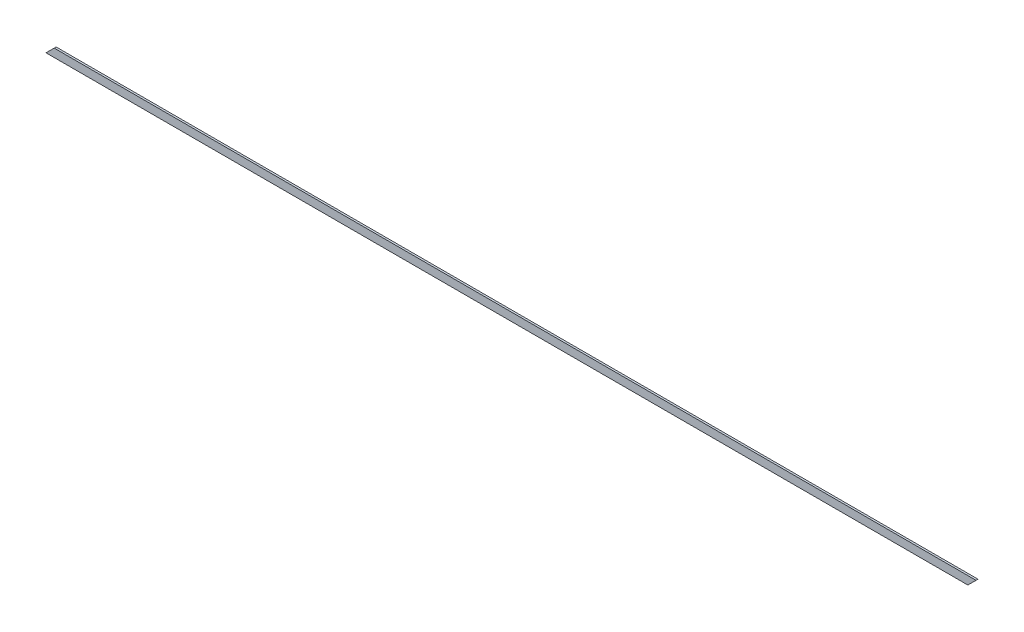
ISO-10303-21;
HEADER;
FILE_DESCRIPTION(('STEP AP214'),'2;1');
FILE_NAME('part.step','',(''),(''),'','','');
FILE_SCHEMA(('AUTOMOTIVE_DESIGN { 1 0 10303 214 1 1 1 1 }'));
ENDSEC;
DATA;
#1=APPLICATION_CONTEXT('core data for automotive mechanical design processes');
#2=APPLICATION_PROTOCOL_DEFINITION('international standard','automotive_design',2000,#1);
#3=PRODUCT_CONTEXT('',#1,'mechanical');
#4=PRODUCT('Part','Part','',(#3));
#5=PRODUCT_RELATED_PRODUCT_CATEGORY('part','',(#4));
#6=PRODUCT_DEFINITION_FORMATION('','',#4);
#7=PRODUCT_DEFINITION_CONTEXT('part definition',#1,'design');
#8=PRODUCT_DEFINITION('design','',#6,#7);
#9=PRODUCT_DEFINITION_SHAPE('','',#8);
#10=(LENGTH_UNIT() NAMED_UNIT(*) SI_UNIT(.MILLI.,.METRE.));
#11=(NAMED_UNIT(*) PLANE_ANGLE_UNIT() SI_UNIT($,.RADIAN.));
#12=(NAMED_UNIT(*) SI_UNIT($,.STERADIAN.) SOLID_ANGLE_UNIT());
#13=UNCERTAINTY_MEASURE_WITH_UNIT(LENGTH_MEASURE(1.E-05),#10,'distance_accuracy_value','');
#14=(GEOMETRIC_REPRESENTATION_CONTEXT(3) GLOBAL_UNCERTAINTY_ASSIGNED_CONTEXT((#13)) GLOBAL_UNIT_ASSIGNED_CONTEXT((#10,
#11,#12)) REPRESENTATION_CONTEXT('',''));
#15=CARTESIAN_POINT('',(0.,0.,0.));
#16=DIRECTION('',(0.,0.,1.));
#17=DIRECTION('',(1.,0.,0.));
#18=AXIS2_PLACEMENT_3D('',#15,#16,#17);
#19=CARTESIAN_POINT('',(266.699999911679,266.699999911679,63.5));
#20=DIRECTION('',(0.707106781186547,-0.707106781186548,0.));
#21=DIRECTION('',(0.707106781186548,0.707106781186547,0.));
#22=AXIS2_PLACEMENT_3D('',#19,#20,#21);
#23=PLANE('',#22);
#24=DIRECTION('',(-0.707106781186548,-0.707106781186547,0.));
#25=VECTOR('',#24,1.);
#26=CARTESIAN_POINT('',(266.699999911679,266.699999911679,0.));
#27=LINE('',#26,#25);
#28=CARTESIAN_POINT('',(266.699999911679,266.699999911679,0.));
#29=VERTEX_POINT('',#28);
#30=CARTESIAN_POINT('',(0.,0.,0.));
#31=VERTEX_POINT('',#30);
#32=EDGE_CURVE('E96',#29,#31,#27,.T.);
#33=ORIENTED_EDGE('',*,*,#32,.T.);
#34=DIRECTION('',(0.,0.,-1.));
#35=VECTOR('',#34,1.);
#36=CARTESIAN_POINT('',(0.,0.,63.5));
#37=LINE('',#36,#35);
#38=CARTESIAN_POINT('',(0.,0.,63.5));
#39=VERTEX_POINT('',#38);
#40=EDGE_CURVE('E11',#39,#31,#37,.T.);
#41=ORIENTED_EDGE('',*,*,#40,.F.);
#42=DIRECTION('',(-0.707106781186548,-0.707106781186547,0.));
#43=VECTOR('',#42,1.);
#44=CARTESIAN_POINT('',(266.699999911679,266.699999911679,63.5));
#45=LINE('',#44,#43);
#46=CARTESIAN_POINT('',(266.699999911679,266.699999911679,63.5));
#47=VERTEX_POINT('',#46);
#48=EDGE_CURVE('E84',#47,#39,#45,.T.);
#49=ORIENTED_EDGE('',*,*,#48,.F.);
#50=DIRECTION('',(0.,0.,-1.));
#51=VECTOR('',#50,1.);
#52=CARTESIAN_POINT('',(266.699999911679,266.699999911679,63.5));
#53=LINE('',#52,#51);
#54=EDGE_CURVE('E92',#47,#29,#53,.T.);
#55=ORIENTED_EDGE('',*,*,#54,.T.);
#56=EDGE_LOOP('',(#33,#41,#49,#55));
#57=FACE_BOUND('',#56,.T.);
#58=ADVANCED_FACE('F33',(#57),#23,.F.);
#59=CARTESIAN_POINT('',(0.,0.,63.5));
#60=DIRECTION('',(0.,1.,0.));
#61=DIRECTION('',(0.,0.,1.));
#62=AXIS2_PLACEMENT_3D('',#59,#60,#61);
#63=PLANE('',#62);
#64=DIRECTION('',(1.,0.,0.));
#65=VECTOR('',#64,1.);
#66=CARTESIAN_POINT('',(0.,0.,0.));
#67=LINE('',#66,#65);
#68=CARTESIAN_POINT('',(30000.,0.,0.));
#69=VERTEX_POINT('',#68);
#70=EDGE_CURVE('E88',#31,#69,#67,.T.);
#71=ORIENTED_EDGE('',*,*,#70,.T.);
#72=DIRECTION('',(0.,0.,-1.));
#73=VECTOR('',#72,1.);
#74=CARTESIAN_POINT('',(30000.,0.,63.5));
#75=LINE('',#74,#73);
#76=CARTESIAN_POINT('',(30000.,0.,63.5));
#77=VERTEX_POINT('',#76);
#78=EDGE_CURVE('E41',#77,#69,#75,.T.);
#79=ORIENTED_EDGE('',*,*,#78,.F.);
#80=DIRECTION('',(1.,0.,0.));
#81=VECTOR('',#80,1.);
#82=CARTESIAN_POINT('',(0.,0.,63.5));
#83=LINE('',#82,#81);
#84=EDGE_CURVE('E79',#39,#77,#83,.T.);
#85=ORIENTED_EDGE('',*,*,#84,.F.);
#86=ORIENTED_EDGE('',*,*,#40,.T.);
#87=EDGE_LOOP('',(#71,#79,#85,#86));
#88=FACE_BOUND('',#87,.T.);
#89=ADVANCED_FACE('F87',(#88),#63,.F.);
#90=CARTESIAN_POINT('',(30000.,0.,63.5));
#91=DIRECTION('',(-0.707106781186551,0.707106781186544,0.));
#92=DIRECTION('',(-0.707106781186544,-0.707106781186551,0.));
#93=AXIS2_PLACEMENT_3D('',#90,#91,#92);
#94=PLANE('',#93);
#95=DIRECTION('',(0.707106781186544,0.707106781186551,0.));
#96=VECTOR('',#95,1.);
#97=CARTESIAN_POINT('',(30000.,0.,0.));
#98=LINE('',#97,#96);
#99=CARTESIAN_POINT('',(30266.6999999117,266.699999911683,0.));
#100=VERTEX_POINT('',#99);
#101=EDGE_CURVE('E66',#69,#100,#98,.T.);
#102=ORIENTED_EDGE('',*,*,#101,.T.);
#103=DIRECTION('',(0.,0.,-1.));
#104=VECTOR('',#103,1.);
#105=CARTESIAN_POINT('',(30266.6999999117,266.699999911683,63.5));
#106=LINE('',#105,#104);
#107=CARTESIAN_POINT('',(30266.6999999117,266.699999911683,63.5));
#108=VERTEX_POINT('',#107);
#109=EDGE_CURVE('E89',#108,#100,#106,.T.);
#110=ORIENTED_EDGE('',*,*,#109,.F.);
#111=DIRECTION('',(0.707106781186544,0.707106781186551,0.));
#112=VECTOR('',#111,1.);
#113=CARTESIAN_POINT('',(30000.,0.,63.5));
#114=LINE('',#113,#112);
#115=EDGE_CURVE('E82',#77,#108,#114,.T.);
#116=ORIENTED_EDGE('',*,*,#115,.F.);
#117=ORIENTED_EDGE('',*,*,#78,.T.);
#118=EDGE_LOOP('',(#102,#110,#116,#117));
#119=FACE_BOUND('',#118,.T.);
#120=ADVANCED_FACE('F90',(#119),#94,.F.);
#121=CARTESIAN_POINT('',(30266.6999999117,266.699999911683,63.5));
#122=DIRECTION('',(0.,-1.,0.));
#123=DIRECTION('',(1.,0.,0.));
#124=AXIS2_PLACEMENT_3D('',#121,#122,#123);
#125=PLANE('',#124);
#126=DIRECTION('',(-1.,0.,0.));
#127=VECTOR('',#126,1.);
#128=CARTESIAN_POINT('',(30266.6999999117,266.699999911683,0.));
#129=LINE('',#128,#127);
#130=EDGE_CURVE('E72',#100,#29,#129,.T.);
#131=ORIENTED_EDGE('',*,*,#130,.T.);
#132=ORIENTED_EDGE('',*,*,#54,.F.);
#133=DIRECTION('',(-1.,0.,0.));
#134=VECTOR('',#133,1.);
#135=CARTESIAN_POINT('',(30266.6999999117,266.699999911683,63.5));
#136=LINE('',#135,#134);
#137=EDGE_CURVE('E49',#108,#47,#136,.T.);
#138=ORIENTED_EDGE('',*,*,#137,.F.);
#139=ORIENTED_EDGE('',*,*,#109,.T.);
#140=EDGE_LOOP('',(#131,#132,#138,#139));
#141=FACE_BOUND('',#140,.T.);
#142=ADVANCED_FACE('F103',(#141),#125,.F.);
#143=CARTESIAN_POINT('',(0.,0.,63.5));
#144=DIRECTION('',(0.,0.,1.));
#145=DIRECTION('',(1.,0.,0.));
#146=AXIS2_PLACEMENT_3D('',#143,#144,#145);
#147=PLANE('',#146);
#148=ORIENTED_EDGE('',*,*,#48,.T.);
#149=ORIENTED_EDGE('',*,*,#84,.T.);
#150=ORIENTED_EDGE('',*,*,#115,.T.);
#151=ORIENTED_EDGE('',*,*,#137,.T.);
#152=EDGE_LOOP('',(#148,#149,#150,#151));
#153=FACE_BOUND('',#152,.T.);
#154=ADVANCED_FACE('F80',(#153),#147,.T.);
#155=CARTESIAN_POINT('',(0.,0.,0.));
#156=DIRECTION('',(0.,0.,1.));
#157=DIRECTION('',(1.,0.,0.));
#158=AXIS2_PLACEMENT_3D('',#155,#156,#157);
#159=PLANE('',#158);
#160=ORIENTED_EDGE('',*,*,#32,.F.);
#161=ORIENTED_EDGE('',*,*,#130,.F.);
#162=ORIENTED_EDGE('',*,*,#101,.F.);
#163=ORIENTED_EDGE('',*,*,#70,.F.);
#164=EDGE_LOOP('',(#160,#161,#162,#163));
#165=FACE_BOUND('',#164,.T.);
#166=ADVANCED_FACE('F106',(#165),#159,.F.);
#167=CLOSED_SHELL('',(#58,#89,#120,#142,#154,#166));
#168=MANIFOLD_SOLID_BREP('B2',#167);
#169=ADVANCED_BREP_SHAPE_REPRESENTATION('',(#18,#168),#14);
#170=SHAPE_DEFINITION_REPRESENTATION(#9,#169);
ENDSEC;
END-ISO-10303-21;
